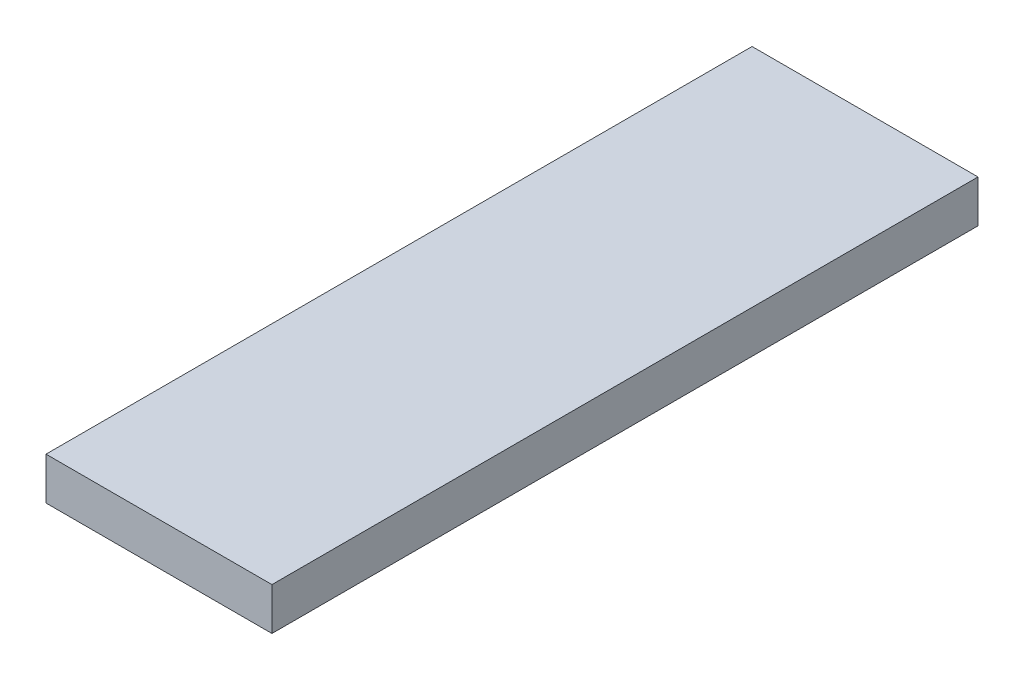
ISO-10303-21;
HEADER;
FILE_DESCRIPTION(('STEP AP214'),'2;1');
FILE_NAME('part.step','',(''),(''),'','','');
FILE_SCHEMA(('AUTOMOTIVE_DESIGN { 1 0 10303 214 1 1 1 1 }'));
ENDSEC;
DATA;
#1=APPLICATION_CONTEXT('core data for automotive mechanical design processes');
#2=APPLICATION_PROTOCOL_DEFINITION('international standard','automotive_design',2000,#1);
#3=PRODUCT_CONTEXT('',#1,'mechanical');
#4=PRODUCT('Part','Part','',(#3));
#5=PRODUCT_RELATED_PRODUCT_CATEGORY('part','',(#4));
#6=PRODUCT_DEFINITION_FORMATION('','',#4);
#7=PRODUCT_DEFINITION_CONTEXT('part definition',#1,'design');
#8=PRODUCT_DEFINITION('design','',#6,#7);
#9=PRODUCT_DEFINITION_SHAPE('','',#8);
#10=(LENGTH_UNIT() NAMED_UNIT(*) SI_UNIT(.MILLI.,.METRE.));
#11=(NAMED_UNIT(*) PLANE_ANGLE_UNIT() SI_UNIT($,.RADIAN.));
#12=(NAMED_UNIT(*) SI_UNIT($,.STERADIAN.) SOLID_ANGLE_UNIT());
#13=UNCERTAINTY_MEASURE_WITH_UNIT(LENGTH_MEASURE(1.E-05),#10,'distance_accuracy_value','');
#14=(GEOMETRIC_REPRESENTATION_CONTEXT(3) GLOBAL_UNCERTAINTY_ASSIGNED_CONTEXT((#13)) GLOBAL_UNIT_ASSIGNED_CONTEXT((#10,
#11,#12)) REPRESENTATION_CONTEXT('',''));
#15=CARTESIAN_POINT('',(0.,0.,0.));
#16=DIRECTION('',(0.,0.,1.));
#17=DIRECTION('',(1.,0.,0.));
#18=AXIS2_PLACEMENT_3D('',#15,#16,#17);
#19=CARTESIAN_POINT('',(-8.,3.,25.));
#20=DIRECTION('',(1.,0.,0.));
#21=DIRECTION('',(0.,0.,-1.));
#22=AXIS2_PLACEMENT_3D('',#19,#20,#21);
#23=PLANE('',#22);
#24=DIRECTION('',(0.,0.,1.));
#25=VECTOR('',#24,1.);
#26=CARTESIAN_POINT('',(-8.,0.,25.));
#27=LINE('',#26,#25);
#28=CARTESIAN_POINT('',(-8.,0.,-25.));
#29=VERTEX_POINT('',#28);
#30=CARTESIAN_POINT('',(-8.,0.,25.));
#31=VERTEX_POINT('',#30);
#32=EDGE_CURVE('E100',#29,#31,#27,.T.);
#33=ORIENTED_EDGE('',*,*,#32,.T.);
#34=DIRECTION('',(0.,-1.,0.));
#35=VECTOR('',#34,1.);
#36=CARTESIAN_POINT('',(-8.,3.,25.));
#37=LINE('',#36,#35);
#38=CARTESIAN_POINT('',(-8.,3.,25.));
#39=VERTEX_POINT('',#38);
#40=EDGE_CURVE('E11',#39,#31,#37,.T.);
#41=ORIENTED_EDGE('',*,*,#40,.F.);
#42=DIRECTION('',(0.,0.,1.));
#43=VECTOR('',#42,1.);
#44=CARTESIAN_POINT('',(-8.,3.,25.));
#45=LINE('',#44,#43);
#46=CARTESIAN_POINT('',(-8.,3.,-25.));
#47=VERTEX_POINT('',#46);
#48=EDGE_CURVE('E88',#47,#39,#45,.T.);
#49=ORIENTED_EDGE('',*,*,#48,.F.);
#50=DIRECTION('',(0.,-1.,0.));
#51=VECTOR('',#50,1.);
#52=CARTESIAN_POINT('',(-8.,3.,-25.));
#53=LINE('',#52,#51);
#54=EDGE_CURVE('E96',#47,#29,#53,.T.);
#55=ORIENTED_EDGE('',*,*,#54,.T.);
#56=EDGE_LOOP('',(#33,#41,#49,#55));
#57=FACE_BOUND('',#56,.T.);
#58=ADVANCED_FACE('F37',(#57),#23,.F.);
#59=CARTESIAN_POINT('',(8.,3.,25.));
#60=DIRECTION('',(0.,0.,-1.));
#61=DIRECTION('',(-1.,0.,0.));
#62=AXIS2_PLACEMENT_3D('',#59,#60,#61);
#63=PLANE('',#62);
#64=DIRECTION('',(1.,0.,0.));
#65=VECTOR('',#64,1.);
#66=CARTESIAN_POINT('',(8.,0.,25.));
#67=LINE('',#66,#65);
#68=CARTESIAN_POINT('',(8.,0.,25.));
#69=VERTEX_POINT('',#68);
#70=EDGE_CURVE('E92',#31,#69,#67,.T.);
#71=ORIENTED_EDGE('',*,*,#70,.T.);
#72=DIRECTION('',(0.,-1.,0.));
#73=VECTOR('',#72,1.);
#74=CARTESIAN_POINT('',(8.,3.,25.));
#75=LINE('',#74,#73);
#76=CARTESIAN_POINT('',(8.,3.,25.));
#77=VERTEX_POINT('',#76);
#78=EDGE_CURVE('E45',#77,#69,#75,.T.);
#79=ORIENTED_EDGE('',*,*,#78,.F.);
#80=DIRECTION('',(1.,0.,0.));
#81=VECTOR('',#80,1.);
#82=CARTESIAN_POINT('',(8.,3.,25.));
#83=LINE('',#82,#81);
#84=EDGE_CURVE('E83',#39,#77,#83,.T.);
#85=ORIENTED_EDGE('',*,*,#84,.F.);
#86=ORIENTED_EDGE('',*,*,#40,.T.);
#87=EDGE_LOOP('',(#71,#79,#85,#86));
#88=FACE_BOUND('',#87,.T.);
#89=ADVANCED_FACE('F91',(#88),#63,.F.);
#90=CARTESIAN_POINT('',(8.,3.,25.));
#91=DIRECTION('',(-1.,0.,0.));
#92=DIRECTION('',(0.,0.,1.));
#93=AXIS2_PLACEMENT_3D('',#90,#91,#92);
#94=PLANE('',#93);
#95=DIRECTION('',(0.,0.,-1.));
#96=VECTOR('',#95,1.);
#97=CARTESIAN_POINT('',(8.,0.,25.));
#98=LINE('',#97,#96);
#99=CARTESIAN_POINT('',(8.,0.,-25.));
#100=VERTEX_POINT('',#99);
#101=EDGE_CURVE('E70',#69,#100,#98,.T.);
#102=ORIENTED_EDGE('',*,*,#101,.T.);
#103=DIRECTION('',(0.,-1.,0.));
#104=VECTOR('',#103,1.);
#105=CARTESIAN_POINT('',(8.,3.,-25.));
#106=LINE('',#105,#104);
#107=CARTESIAN_POINT('',(8.,3.,-25.));
#108=VERTEX_POINT('',#107);
#109=EDGE_CURVE('E93',#108,#100,#106,.T.);
#110=ORIENTED_EDGE('',*,*,#109,.F.);
#111=DIRECTION('',(0.,0.,-1.));
#112=VECTOR('',#111,1.);
#113=CARTESIAN_POINT('',(8.,3.,25.));
#114=LINE('',#113,#112);
#115=EDGE_CURVE('E86',#77,#108,#114,.T.);
#116=ORIENTED_EDGE('',*,*,#115,.F.);
#117=ORIENTED_EDGE('',*,*,#78,.T.);
#118=EDGE_LOOP('',(#102,#110,#116,#117));
#119=FACE_BOUND('',#118,.T.);
#120=ADVANCED_FACE('F94',(#119),#94,.F.);
#121=CARTESIAN_POINT('',(8.,3.,-25.));
#122=DIRECTION('',(0.,0.,1.));
#123=DIRECTION('',(1.,0.,0.));
#124=AXIS2_PLACEMENT_3D('',#121,#122,#123);
#125=PLANE('',#124);
#126=DIRECTION('',(-1.,0.,0.));
#127=VECTOR('',#126,1.);
#128=CARTESIAN_POINT('',(8.,0.,-25.));
#129=LINE('',#128,#127);
#130=EDGE_CURVE('E76',#100,#29,#129,.T.);
#131=ORIENTED_EDGE('',*,*,#130,.T.);
#132=ORIENTED_EDGE('',*,*,#54,.F.);
#133=DIRECTION('',(-1.,0.,0.));
#134=VECTOR('',#133,1.);
#135=CARTESIAN_POINT('',(8.,3.,-25.));
#136=LINE('',#135,#134);
#137=EDGE_CURVE('E53',#108,#47,#136,.T.);
#138=ORIENTED_EDGE('',*,*,#137,.F.);
#139=ORIENTED_EDGE('',*,*,#109,.T.);
#140=EDGE_LOOP('',(#131,#132,#138,#139));
#141=FACE_BOUND('',#140,.T.);
#142=ADVANCED_FACE('F107',(#141),#125,.F.);
#143=CARTESIAN_POINT('',(0.,3.,0.));
#144=DIRECTION('',(0.,1.,0.));
#145=DIRECTION('',(0.,0.,1.));
#146=AXIS2_PLACEMENT_3D('',#143,#144,#145);
#147=PLANE('',#146);
#148=ORIENTED_EDGE('',*,*,#48,.T.);
#149=ORIENTED_EDGE('',*,*,#84,.T.);
#150=ORIENTED_EDGE('',*,*,#115,.T.);
#151=ORIENTED_EDGE('',*,*,#137,.T.);
#152=EDGE_LOOP('',(#148,#149,#150,#151));
#153=FACE_BOUND('',#152,.T.);
#154=ADVANCED_FACE('F84',(#153),#147,.T.);
#155=CARTESIAN_POINT('',(0.,0.,0.));
#156=DIRECTION('',(0.,1.,0.));
#157=DIRECTION('',(0.,0.,1.));
#158=AXIS2_PLACEMENT_3D('',#155,#156,#157);
#159=PLANE('',#158);
#160=ORIENTED_EDGE('',*,*,#32,.F.);
#161=ORIENTED_EDGE('',*,*,#130,.F.);
#162=ORIENTED_EDGE('',*,*,#101,.F.);
#163=ORIENTED_EDGE('',*,*,#70,.F.);
#164=EDGE_LOOP('',(#160,#161,#162,#163));
#165=FACE_BOUND('',#164,.T.);
#166=ADVANCED_FACE('F110',(#165),#159,.F.);
#167=CLOSED_SHELL('',(#58,#89,#120,#142,#154,#166));
#168=MANIFOLD_SOLID_BREP('B2',#167);
#169=ADVANCED_BREP_SHAPE_REPRESENTATION('',(#18,#168),#14);
#170=SHAPE_DEFINITION_REPRESENTATION(#9,#169);
ENDSEC;
END-ISO-10303-21;
